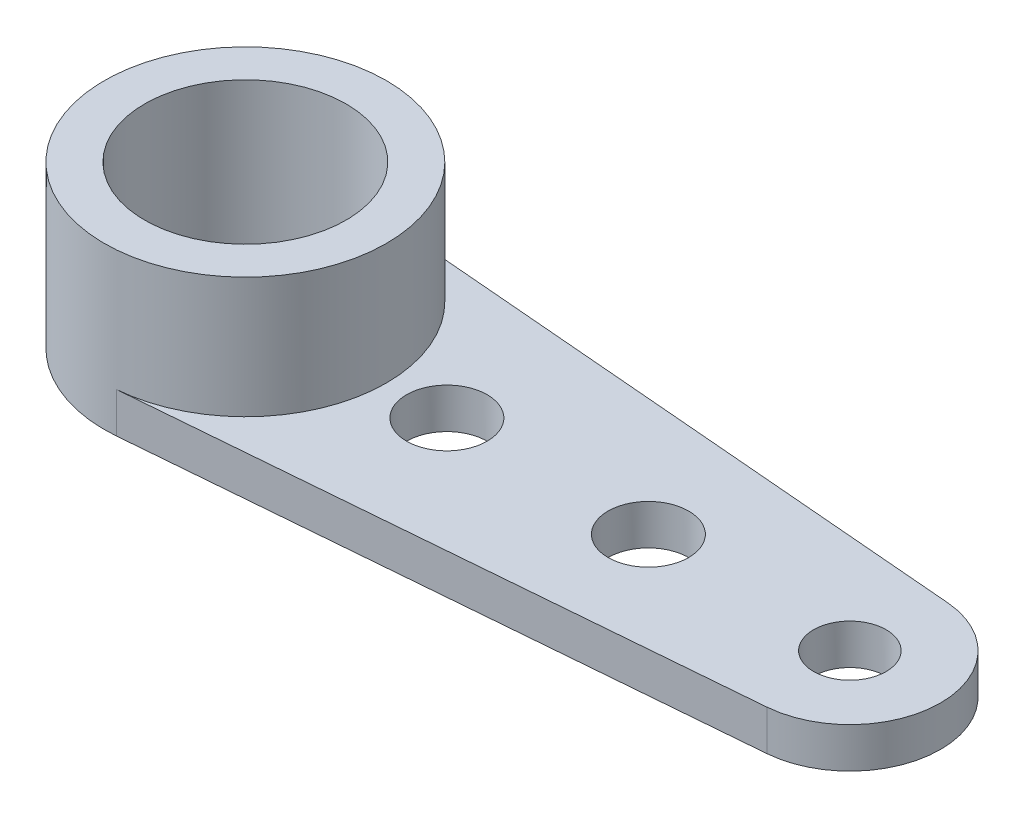
ISO-10303-21;
HEADER;
FILE_DESCRIPTION(('STEP AP214'),'2;1');
FILE_NAME('part.step','',(''),(''),'','','');
FILE_SCHEMA(('AUTOMOTIVE_DESIGN { 1 0 10303 214 1 1 1 1 }'));
ENDSEC;
DATA;
#1=APPLICATION_CONTEXT('core data for automotive mechanical design processes');
#2=APPLICATION_PROTOCOL_DEFINITION('international standard','automotive_design',2000,#1);
#3=PRODUCT_CONTEXT('',#1,'mechanical');
#4=PRODUCT('Part','Part','',(#3));
#5=PRODUCT_RELATED_PRODUCT_CATEGORY('part','',(#4));
#6=PRODUCT_DEFINITION_FORMATION('','',#4);
#7=PRODUCT_DEFINITION_CONTEXT('part definition',#1,'design');
#8=PRODUCT_DEFINITION('design','',#6,#7);
#9=PRODUCT_DEFINITION_SHAPE('','',#8);
#10=(LENGTH_UNIT() NAMED_UNIT(*) SI_UNIT(.MILLI.,.METRE.));
#11=(NAMED_UNIT(*) PLANE_ANGLE_UNIT() SI_UNIT($,.RADIAN.));
#12=(NAMED_UNIT(*) SI_UNIT($,.STERADIAN.) SOLID_ANGLE_UNIT());
#13=UNCERTAINTY_MEASURE_WITH_UNIT(LENGTH_MEASURE(1.E-05),#10,'distance_accuracy_value','');
#14=(GEOMETRIC_REPRESENTATION_CONTEXT(3) GLOBAL_UNCERTAINTY_ASSIGNED_CONTEXT((#13)) GLOBAL_UNIT_ASSIGNED_CONTEXT((#10,
#11,#12)) REPRESENTATION_CONTEXT('',''));
#15=CARTESIAN_POINT('',(0.,0.,0.));
#16=DIRECTION('',(0.,0.,1.));
#17=DIRECTION('',(1.,0.,0.));
#18=AXIS2_PLACEMENT_3D('',#15,#16,#17);
#19=CARTESIAN_POINT('',(0.291666666666666,1.,-3.48782605007124));
#20=DIRECTION('',(-0.0833333333333333,0.,0.996521728591783));
#21=DIRECTION('',(-0.996521728591783,0.,-0.0833333333333333));
#22=AXIS2_PLACEMENT_3D('',#19,#20,#21);
#23=PLANE('',#22);
#24=DIRECTION('',(0.996521728591783,0.,0.0833333333333333));
#25=VECTOR('',#24,1.);
#26=CARTESIAN_POINT('',(0.291666666666666,0.,-3.48782605007124));
#27=LINE('',#26,#25);
#28=CARTESIAN_POINT('',(0.291666666666667,0.,-3.48782605007124));
#29=VERTEX_POINT('',#28);
#30=CARTESIAN_POINT('',(15.1875,0.,-2.24217388933151));
#31=VERTEX_POINT('',#30);
#32=EDGE_CURVE('E103',#29,#31,#27,.T.);
#33=ORIENTED_EDGE('',*,*,#32,.F.);
#34=DIRECTION('',(0.,-1.,0.));
#35=VECTOR('',#34,1.);
#36=CARTESIAN_POINT('',(0.291666666666667,1.,-3.48782605007124));
#37=LINE('',#36,#35);
#38=CARTESIAN_POINT('',(0.291666666666667,1.,-3.48782605007124));
#39=VERTEX_POINT('',#38);
#40=EDGE_CURVE('E91',#39,#29,#37,.T.);
#41=ORIENTED_EDGE('',*,*,#40,.F.);
#42=DIRECTION('',(0.996521728591783,0.,0.0833333333333333));
#43=VECTOR('',#42,1.);
#44=CARTESIAN_POINT('',(0.291666666666666,1.,-3.48782605007124));
#45=LINE('',#44,#43);
#46=CARTESIAN_POINT('',(15.1875,1.,-2.24217388933151));
#47=VERTEX_POINT('',#46);
#48=EDGE_CURVE('E99',#39,#47,#45,.T.);
#49=ORIENTED_EDGE('',*,*,#48,.T.);
#50=DIRECTION('',(0.,-1.,0.));
#51=VECTOR('',#50,1.);
#52=CARTESIAN_POINT('',(15.1875,1.,-2.24217388933151));
#53=LINE('',#52,#51);
#54=EDGE_CURVE('E11',#47,#31,#53,.T.);
#55=ORIENTED_EDGE('',*,*,#54,.T.);
#56=EDGE_LOOP('',(#33,#41,#49,#55));
#57=FACE_BOUND('',#56,.T.);
#58=ADVANCED_FACE('F45',(#57),#23,.F.);
#59=CARTESIAN_POINT('',(15.,1.,0.));
#60=DIRECTION('',(0.,-1.,0.));
#61=DIRECTION('',(0.,0.,1.));
#62=AXIS2_PLACEMENT_3D('',#59,#60,#61);
#63=CYLINDRICAL_SURFACE('',#62,2.25);
#64=CARTESIAN_POINT('',(15.,0.,0.));
#65=DIRECTION('',(0.,-1.,0.));
#66=DIRECTION('',(0.,0.,-1.));
#67=AXIS2_PLACEMENT_3D('',#64,#65,#66);
#68=CIRCLE('',#67,2.25);
#69=CARTESIAN_POINT('',(15.1875,0.,2.24217388933151));
#70=VERTEX_POINT('',#69);
#71=EDGE_CURVE('E115',#31,#70,#68,.T.);
#72=ORIENTED_EDGE('',*,*,#71,.F.);
#73=ORIENTED_EDGE('',*,*,#54,.F.);
#74=CARTESIAN_POINT('',(15.,1.,0.));
#75=DIRECTION('',(0.,-1.,0.));
#76=DIRECTION('',(0.,0.,-1.));
#77=AXIS2_PLACEMENT_3D('',#74,#75,#76);
#78=CIRCLE('',#77,2.25);
#79=CARTESIAN_POINT('',(15.1875,1.,2.24217388933151));
#80=VERTEX_POINT('',#79);
#81=EDGE_CURVE('E85',#47,#80,#78,.T.);
#82=ORIENTED_EDGE('',*,*,#81,.T.);
#83=DIRECTION('',(0.,-1.,0.));
#84=VECTOR('',#83,1.);
#85=CARTESIAN_POINT('',(15.1875,1.,2.24217388933151));
#86=LINE('',#85,#84);
#87=EDGE_CURVE('E53',#80,#70,#86,.T.);
#88=ORIENTED_EDGE('',*,*,#87,.T.);
#89=EDGE_LOOP('',(#72,#73,#82,#88));
#90=FACE_BOUND('',#89,.T.);
#91=ADVANCED_FACE('F114',(#90),#63,.T.);
#92=CARTESIAN_POINT('',(0.291666666666667,1.,3.48782605007124));
#93=DIRECTION('',(0.0833333333333333,0.,0.996521728591783));
#94=DIRECTION('',(-0.996521728591783,0.,0.0833333333333333));
#95=AXIS2_PLACEMENT_3D('',#92,#93,#94);
#96=PLANE('',#95);
#97=DIRECTION('',(0.996521728591783,0.,-0.0833333333333333));
#98=VECTOR('',#97,1.);
#99=CARTESIAN_POINT('',(0.291666666666667,0.,3.48782605007124));
#100=LINE('',#99,#98);
#101=CARTESIAN_POINT('',(0.291666666666667,0.,3.48782605007124));
#102=VERTEX_POINT('',#101);
#103=EDGE_CURVE('E118',#102,#70,#100,.T.);
#104=ORIENTED_EDGE('',*,*,#103,.T.);
#105=ORIENTED_EDGE('',*,*,#87,.F.);
#106=DIRECTION('',(0.996521728591783,0.,-0.0833333333333333));
#107=VECTOR('',#106,1.);
#108=CARTESIAN_POINT('',(0.291666666666667,1.,3.48782605007124));
#109=LINE('',#108,#107);
#110=CARTESIAN_POINT('',(0.291666666666667,1.,3.48782605007124));
#111=VERTEX_POINT('',#110);
#112=EDGE_CURVE('E104',#111,#80,#109,.T.);
#113=ORIENTED_EDGE('',*,*,#112,.F.);
#114=DIRECTION('',(0.,-1.,0.));
#115=VECTOR('',#114,1.);
#116=CARTESIAN_POINT('',(0.291666666666667,1.,3.48782605007124));
#117=LINE('',#116,#115);
#118=EDGE_CURVE('E93',#111,#102,#117,.T.);
#119=ORIENTED_EDGE('',*,*,#118,.T.);
#120=EDGE_LOOP('',(#104,#105,#113,#119));
#121=FACE_BOUND('',#120,.T.);
#122=ADVANCED_FACE('F167',(#121),#96,.T.);
#123=CARTESIAN_POINT('',(0.,1.,0.));
#124=DIRECTION('',(0.,-1.,0.));
#125=DIRECTION('',(0.,0.,1.));
#126=AXIS2_PLACEMENT_3D('',#123,#124,#125);
#127=CYLINDRICAL_SURFACE('',#126,3.5);
#128=CARTESIAN_POINT('',(0.,0.,0.));
#129=DIRECTION('',(0.,-1.,0.));
#130=DIRECTION('',(0.,0.,-1.));
#131=AXIS2_PLACEMENT_3D('',#128,#129,#130);
#132=CIRCLE('',#131,3.5);
#133=EDGE_CURVE('E78',#102,#29,#132,.T.);
#134=ORIENTED_EDGE('',*,*,#133,.F.);
#135=ORIENTED_EDGE('',*,*,#118,.F.);
#136=CARTESIAN_POINT('',(0.,1.,0.));
#137=DIRECTION('',(0.,-1.,0.));
#138=DIRECTION('',(0.,0.,-1.));
#139=AXIS2_PLACEMENT_3D('',#136,#137,#138);
#140=CIRCLE('',#139,3.5);
#141=EDGE_CURVE('E61',#39,#111,#140,.T.);
#142=ORIENTED_EDGE('',*,*,#141,.F.);
#143=ORIENTED_EDGE('',*,*,#40,.T.);
#144=EDGE_LOOP('',(#134,#135,#142,#143));
#145=FACE_BOUND('',#144,.T.);
#146=CARTESIAN_POINT('',(0.,4.,0.));
#147=DIRECTION('',(0.,-1.,0.));
#148=DIRECTION('',(0.,0.,-1.));
#149=AXIS2_PLACEMENT_3D('',#146,#147,#148);
#150=CIRCLE('',#149,3.5);
#151=CARTESIAN_POINT('',(0.,4.,-3.5));
#152=VERTEX_POINT('',#151);
#153=EDGE_CURVE('E95',#152,#152,#150,.T.);
#154=ORIENTED_EDGE('',*,*,#153,.T.);
#155=EDGE_LOOP('',(#154));
#156=FACE_BOUND('',#155,.T.);
#157=ADVANCED_FACE('F88',(#145,#156),#127,.T.);
#158=CARTESIAN_POINT('',(0.,1.,0.));
#159=DIRECTION('',(0.,1.,0.));
#160=DIRECTION('',(0.,0.,-1.));
#161=AXIS2_PLACEMENT_3D('',#158,#159,#160);
#162=PLANE('',#161);
#163=CARTESIAN_POINT('',(5.,1.,0.));
#164=DIRECTION('',(0.,-1.,0.));
#165=DIRECTION('',(0.,0.,-1.));
#166=AXIS2_PLACEMENT_3D('',#163,#164,#165);
#167=CIRCLE('',#166,1.);
#168=CARTESIAN_POINT('',(5.,1.,-1.));
#169=VERTEX_POINT('',#168);
#170=EDGE_CURVE('E136',#169,#169,#167,.T.);
#171=ORIENTED_EDGE('',*,*,#170,.T.);
#172=EDGE_LOOP('',(#171));
#173=FACE_BOUND('',#172,.T.);
#174=CARTESIAN_POINT('',(10.,1.,0.));
#175=DIRECTION('',(0.,-1.,0.));
#176=DIRECTION('',(0.,0.,-1.));
#177=AXIS2_PLACEMENT_3D('',#174,#175,#176);
#178=CIRCLE('',#177,1.);
#179=CARTESIAN_POINT('',(10.,1.,-1.));
#180=VERTEX_POINT('',#179);
#181=EDGE_CURVE('E139',#180,#180,#178,.T.);
#182=ORIENTED_EDGE('',*,*,#181,.T.);
#183=EDGE_LOOP('',(#182));
#184=FACE_BOUND('',#183,.T.);
#185=CARTESIAN_POINT('',(15.,1.,0.));
#186=DIRECTION('',(0.,-1.,0.));
#187=DIRECTION('',(0.,0.,-1.));
#188=AXIS2_PLACEMENT_3D('',#185,#186,#187);
#189=CIRCLE('',#188,0.9);
#190=CARTESIAN_POINT('',(15.,1.,-0.9));
#191=VERTEX_POINT('',#190);
#192=EDGE_CURVE('E128',#191,#191,#189,.T.);
#193=ORIENTED_EDGE('',*,*,#192,.T.);
#194=EDGE_LOOP('',(#193));
#195=FACE_BOUND('',#194,.T.);
#196=ORIENTED_EDGE('',*,*,#141,.T.);
#197=ORIENTED_EDGE('',*,*,#112,.T.);
#198=ORIENTED_EDGE('',*,*,#81,.F.);
#199=ORIENTED_EDGE('',*,*,#48,.F.);
#200=EDGE_LOOP('',(#196,#197,#198,#199));
#201=FACE_BOUND('',#200,.T.);
#202=ADVANCED_FACE('F100',(#173,#184,#195,#201),#162,.T.);
#203=CARTESIAN_POINT('',(0.,0.,0.));
#204=DIRECTION('',(0.,1.,0.));
#205=DIRECTION('',(0.,0.,-1.));
#206=AXIS2_PLACEMENT_3D('',#203,#204,#205);
#207=PLANE('',#206);
#208=CARTESIAN_POINT('',(5.,0.,0.));
#209=DIRECTION('',(0.,1.,0.));
#210=DIRECTION('',(0.,0.,1.));
#211=AXIS2_PLACEMENT_3D('',#208,#209,#210);
#212=CIRCLE('',#211,1.);
#213=CARTESIAN_POINT('',(5.,0.,1.));
#214=VERTEX_POINT('',#213);
#215=EDGE_CURVE('E142',#214,#214,#212,.T.);
#216=ORIENTED_EDGE('',*,*,#215,.T.);
#217=EDGE_LOOP('',(#216));
#218=FACE_BOUND('',#217,.T.);
#219=CARTESIAN_POINT('',(10.,0.,0.));
#220=DIRECTION('',(0.,1.,0.));
#221=DIRECTION('',(0.,0.,1.));
#222=AXIS2_PLACEMENT_3D('',#219,#220,#221);
#223=CIRCLE('',#222,1.);
#224=CARTESIAN_POINT('',(10.,0.,1.));
#225=VERTEX_POINT('',#224);
#226=EDGE_CURVE('E143',#225,#225,#223,.T.);
#227=ORIENTED_EDGE('',*,*,#226,.T.);
#228=EDGE_LOOP('',(#227));
#229=FACE_BOUND('',#228,.T.);
#230=CARTESIAN_POINT('',(15.,0.,0.));
#231=DIRECTION('',(0.,1.,0.));
#232=DIRECTION('',(0.,0.,1.));
#233=AXIS2_PLACEMENT_3D('',#230,#231,#232);
#234=CIRCLE('',#233,0.9);
#235=CARTESIAN_POINT('',(15.,0.,0.9));
#236=VERTEX_POINT('',#235);
#237=EDGE_CURVE('E133',#236,#236,#234,.T.);
#238=ORIENTED_EDGE('',*,*,#237,.T.);
#239=EDGE_LOOP('',(#238));
#240=FACE_BOUND('',#239,.T.);
#241=CARTESIAN_POINT('',(0.,0.,0.));
#242=DIRECTION('',(0.,-1.,0.));
#243=DIRECTION('',(0.,0.,-1.));
#244=AXIS2_PLACEMENT_3D('',#241,#242,#243);
#245=CIRCLE('',#244,2.5);
#246=CARTESIAN_POINT('',(0.,0.,-2.5));
#247=VERTEX_POINT('',#246);
#248=EDGE_CURVE('E96',#247,#247,#245,.T.);
#249=ORIENTED_EDGE('',*,*,#248,.F.);
#250=EDGE_LOOP('',(#249));
#251=FACE_BOUND('',#250,.T.);
#252=ORIENTED_EDGE('',*,*,#32,.T.);
#253=ORIENTED_EDGE('',*,*,#71,.T.);
#254=ORIENTED_EDGE('',*,*,#103,.F.);
#255=ORIENTED_EDGE('',*,*,#133,.T.);
#256=EDGE_LOOP('',(#252,#253,#254,#255));
#257=FACE_BOUND('',#256,.T.);
#258=ADVANCED_FACE('F117',(#218,#229,#240,#251,#257),#207,.F.);
#259=CARTESIAN_POINT('',(0.,4.,0.));
#260=DIRECTION('',(0.,1.,0.));
#261=DIRECTION('',(0.,0.,-1.));
#262=AXIS2_PLACEMENT_3D('',#259,#260,#261);
#263=PLANE('',#262);
#264=CARTESIAN_POINT('',(0.,4.,0.));
#265=DIRECTION('',(0.,-1.,0.));
#266=DIRECTION('',(0.,0.,-1.));
#267=AXIS2_PLACEMENT_3D('',#264,#265,#266);
#268=CIRCLE('',#267,2.5);
#269=CARTESIAN_POINT('',(0.,4.,-2.5));
#270=VERTEX_POINT('',#269);
#271=EDGE_CURVE('E125',#270,#270,#268,.T.);
#272=ORIENTED_EDGE('',*,*,#271,.T.);
#273=EDGE_LOOP('',(#272));
#274=FACE_BOUND('',#273,.T.);
#275=ORIENTED_EDGE('',*,*,#153,.F.);
#276=EDGE_LOOP('',(#275));
#277=FACE_BOUND('',#276,.T.);
#278=ADVANCED_FACE('F177',(#274,#277),#263,.T.);
#279=CARTESIAN_POINT('',(0.,0.,0.));
#280=DIRECTION('',(0.,1.,0.));
#281=DIRECTION('',(0.,0.,-1.));
#282=AXIS2_PLACEMENT_3D('',#279,#280,#281);
#283=CYLINDRICAL_SURFACE('',#282,2.5);
#284=ORIENTED_EDGE('',*,*,#248,.T.);
#285=EDGE_LOOP('',(#284));
#286=FACE_BOUND('',#285,.T.);
#287=ORIENTED_EDGE('',*,*,#271,.F.);
#288=EDGE_LOOP('',(#287));
#289=FACE_BOUND('',#288,.T.);
#290=ADVANCED_FACE('F183',(#286,#289),#283,.F.);
#291=CARTESIAN_POINT('',(15.,4.,0.));
#292=DIRECTION('',(0.,-1.,0.));
#293=DIRECTION('',(0.,0.,1.));
#294=AXIS2_PLACEMENT_3D('',#291,#292,#293);
#295=CYLINDRICAL_SURFACE('',#294,0.9);
#296=ORIENTED_EDGE('',*,*,#192,.F.);
#297=EDGE_LOOP('',(#296));
#298=FACE_BOUND('',#297,.T.);
#299=ORIENTED_EDGE('',*,*,#237,.F.);
#300=EDGE_LOOP('',(#299));
#301=FACE_BOUND('',#300,.T.);
#302=ADVANCED_FACE('F159',(#298,#301),#295,.F.);
#303=CARTESIAN_POINT('',(10.,4.,0.));
#304=DIRECTION('',(0.,-1.,0.));
#305=DIRECTION('',(0.,0.,1.));
#306=AXIS2_PLACEMENT_3D('',#303,#304,#305);
#307=CYLINDRICAL_SURFACE('',#306,1.);
#308=ORIENTED_EDGE('',*,*,#181,.F.);
#309=EDGE_LOOP('',(#308));
#310=FACE_BOUND('',#309,.T.);
#311=ORIENTED_EDGE('',*,*,#226,.F.);
#312=EDGE_LOOP('',(#311));
#313=FACE_BOUND('',#312,.T.);
#314=ADVANCED_FACE('F153',(#310,#313),#307,.F.);
#315=CARTESIAN_POINT('',(5.,4.,0.));
#316=DIRECTION('',(0.,-1.,0.));
#317=DIRECTION('',(0.,0.,1.));
#318=AXIS2_PLACEMENT_3D('',#315,#316,#317);
#319=CYLINDRICAL_SURFACE('',#318,1.);
#320=ORIENTED_EDGE('',*,*,#170,.F.);
#321=EDGE_LOOP('',(#320));
#322=FACE_BOUND('',#321,.T.);
#323=ORIENTED_EDGE('',*,*,#215,.F.);
#324=EDGE_LOOP('',(#323));
#325=FACE_BOUND('',#324,.T.);
#326=ADVANCED_FACE('F151',(#322,#325),#319,.F.);
#327=CLOSED_SHELL('',(#58,#91,#122,#157,#202,#258,#278,#290,#302,#314,#326));
#328=MANIFOLD_SOLID_BREP('B2',#327);
#329=ADVANCED_BREP_SHAPE_REPRESENTATION('',(#18,#328),#14);
#330=SHAPE_DEFINITION_REPRESENTATION(#9,#329);
ENDSEC;
END-ISO-10303-21;
